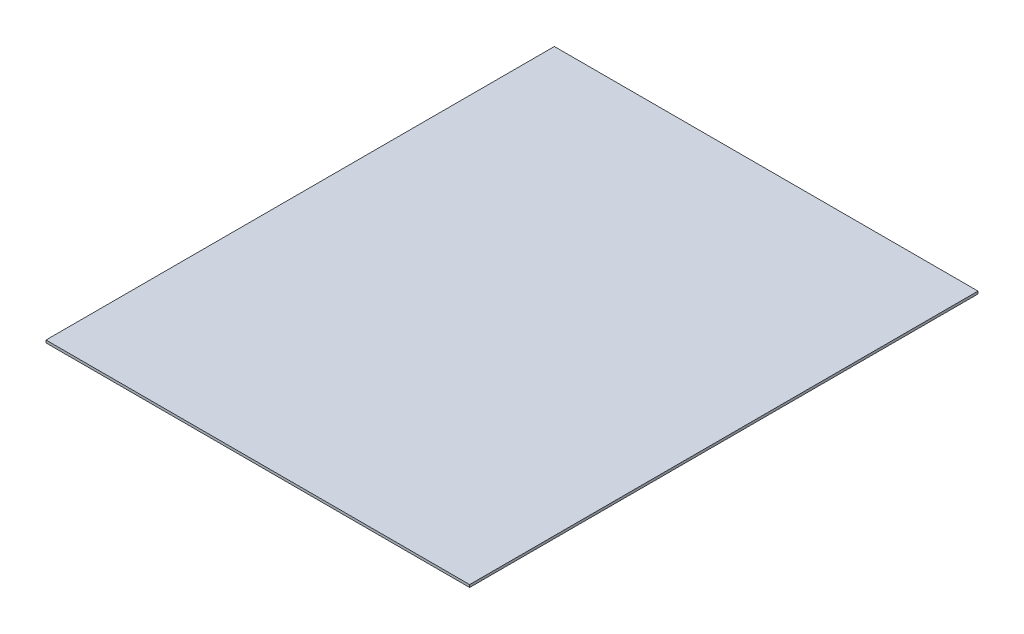
ISO-10303-21;
HEADER;
FILE_DESCRIPTION(('STEP AP214'),'2;1');
FILE_NAME('part.step','',(''),(''),'','','');
FILE_SCHEMA(('AUTOMOTIVE_DESIGN { 1 0 10303 214 1 1 1 1 }'));
ENDSEC;
DATA;
#1=APPLICATION_CONTEXT('core data for automotive mechanical design processes');
#2=APPLICATION_PROTOCOL_DEFINITION('international standard','automotive_design',2000,#1);
#3=PRODUCT_CONTEXT('',#1,'mechanical');
#4=PRODUCT('Part','Part','',(#3));
#5=PRODUCT_RELATED_PRODUCT_CATEGORY('part','',(#4));
#6=PRODUCT_DEFINITION_FORMATION('','',#4);
#7=PRODUCT_DEFINITION_CONTEXT('part definition',#1,'design');
#8=PRODUCT_DEFINITION('design','',#6,#7);
#9=PRODUCT_DEFINITION_SHAPE('','',#8);
#10=(LENGTH_UNIT() NAMED_UNIT(*) SI_UNIT(.MILLI.,.METRE.));
#11=(NAMED_UNIT(*) PLANE_ANGLE_UNIT() SI_UNIT($,.RADIAN.));
#12=(NAMED_UNIT(*) SI_UNIT($,.STERADIAN.) SOLID_ANGLE_UNIT());
#13=UNCERTAINTY_MEASURE_WITH_UNIT(LENGTH_MEASURE(1.E-05),#10,'distance_accuracy_value','');
#14=(GEOMETRIC_REPRESENTATION_CONTEXT(3) GLOBAL_UNCERTAINTY_ASSIGNED_CONTEXT((#13)) GLOBAL_UNIT_ASSIGNED_CONTEXT((#10,
#11,#12)) REPRESENTATION_CONTEXT('',''));
#15=CARTESIAN_POINT('',(0.,0.,0.));
#16=DIRECTION('',(0.,0.,1.));
#17=DIRECTION('',(1.,0.,0.));
#18=AXIS2_PLACEMENT_3D('',#15,#16,#17);
#19=CARTESIAN_POINT('',(-20.3333333333333,3.,-15.5833333333333));
#20=DIRECTION('',(1.,0.,0.));
#21=DIRECTION('',(0.,0.,-1.));
#22=AXIS2_PLACEMENT_3D('',#19,#20,#21);
#23=PLANE('',#22);
#24=DIRECTION('',(0.,0.,1.));
#25=VECTOR('',#24,1.);
#26=CARTESIAN_POINT('',(-20.3333333333333,0.,-15.5833333333333));
#27=LINE('',#26,#25);
#28=CARTESIAN_POINT('',(-20.3333333333333,0.,-15.5833333333333));
#29=VERTEX_POINT('',#28);
#30=CARTESIAN_POINT('',(-20.3333333333333,0.,584.416666666667));
#31=VERTEX_POINT('',#30);
#32=EDGE_CURVE('E96',#29,#31,#27,.T.);
#33=ORIENTED_EDGE('',*,*,#32,.T.);
#34=DIRECTION('',(0.,-1.,0.));
#35=VECTOR('',#34,1.);
#36=CARTESIAN_POINT('',(-20.3333333333333,3.,584.416666666667));
#37=LINE('',#36,#35);
#38=CARTESIAN_POINT('',(-20.3333333333333,3.,584.416666666667));
#39=VERTEX_POINT('',#38);
#40=EDGE_CURVE('E11',#39,#31,#37,.T.);
#41=ORIENTED_EDGE('',*,*,#40,.F.);
#42=DIRECTION('',(0.,0.,1.));
#43=VECTOR('',#42,1.);
#44=CARTESIAN_POINT('',(-20.3333333333333,3.,-15.5833333333333));
#45=LINE('',#44,#43);
#46=CARTESIAN_POINT('',(-20.3333333333333,3.,-15.5833333333333));
#47=VERTEX_POINT('',#46);
#48=EDGE_CURVE('E84',#47,#39,#45,.T.);
#49=ORIENTED_EDGE('',*,*,#48,.F.);
#50=DIRECTION('',(0.,-1.,0.));
#51=VECTOR('',#50,1.);
#52=CARTESIAN_POINT('',(-20.3333333333333,3.,-15.5833333333333));
#53=LINE('',#52,#51);
#54=EDGE_CURVE('E92',#47,#29,#53,.T.);
#55=ORIENTED_EDGE('',*,*,#54,.T.);
#56=EDGE_LOOP('',(#33,#41,#49,#55));
#57=FACE_BOUND('',#56,.T.);
#58=ADVANCED_FACE('F33',(#57),#23,.F.);
#59=CARTESIAN_POINT('',(-20.3333333333333,3.,584.416666666667));
#60=DIRECTION('',(0.,0.,-1.));
#61=DIRECTION('',(-1.,0.,0.));
#62=AXIS2_PLACEMENT_3D('',#59,#60,#61);
#63=PLANE('',#62);
#64=DIRECTION('',(1.,0.,0.));
#65=VECTOR('',#64,1.);
#66=CARTESIAN_POINT('',(-20.3333333333333,0.,584.416666666667));
#67=LINE('',#66,#65);
#68=CARTESIAN_POINT('',(479.666666666667,0.,584.416666666667));
#69=VERTEX_POINT('',#68);
#70=EDGE_CURVE('E88',#31,#69,#67,.T.);
#71=ORIENTED_EDGE('',*,*,#70,.T.);
#72=DIRECTION('',(0.,-1.,0.));
#73=VECTOR('',#72,1.);
#74=CARTESIAN_POINT('',(479.666666666667,3.,584.416666666667));
#75=LINE('',#74,#73);
#76=CARTESIAN_POINT('',(479.666666666667,3.,584.416666666667));
#77=VERTEX_POINT('',#76);
#78=EDGE_CURVE('E41',#77,#69,#75,.T.);
#79=ORIENTED_EDGE('',*,*,#78,.F.);
#80=DIRECTION('',(1.,0.,0.));
#81=VECTOR('',#80,1.);
#82=CARTESIAN_POINT('',(-20.3333333333333,3.,584.416666666667));
#83=LINE('',#82,#81);
#84=EDGE_CURVE('E79',#39,#77,#83,.T.);
#85=ORIENTED_EDGE('',*,*,#84,.F.);
#86=ORIENTED_EDGE('',*,*,#40,.T.);
#87=EDGE_LOOP('',(#71,#79,#85,#86));
#88=FACE_BOUND('',#87,.T.);
#89=ADVANCED_FACE('F87',(#88),#63,.F.);
#90=CARTESIAN_POINT('',(479.666666666667,3.,-15.5833333333333));
#91=DIRECTION('',(-1.,0.,0.));
#92=DIRECTION('',(0.,0.,1.));
#93=AXIS2_PLACEMENT_3D('',#90,#91,#92);
#94=PLANE('',#93);
#95=DIRECTION('',(0.,0.,-1.));
#96=VECTOR('',#95,1.);
#97=CARTESIAN_POINT('',(479.666666666667,0.,-15.5833333333333));
#98=LINE('',#97,#96);
#99=CARTESIAN_POINT('',(479.666666666667,0.,-15.5833333333333));
#100=VERTEX_POINT('',#99);
#101=EDGE_CURVE('E66',#69,#100,#98,.T.);
#102=ORIENTED_EDGE('',*,*,#101,.T.);
#103=DIRECTION('',(0.,-1.,0.));
#104=VECTOR('',#103,1.);
#105=CARTESIAN_POINT('',(479.666666666667,3.,-15.5833333333333));
#106=LINE('',#105,#104);
#107=CARTESIAN_POINT('',(479.666666666667,3.,-15.5833333333333));
#108=VERTEX_POINT('',#107);
#109=EDGE_CURVE('E89',#108,#100,#106,.T.);
#110=ORIENTED_EDGE('',*,*,#109,.F.);
#111=DIRECTION('',(0.,0.,-1.));
#112=VECTOR('',#111,1.);
#113=CARTESIAN_POINT('',(479.666666666667,3.,-15.5833333333333));
#114=LINE('',#113,#112);
#115=EDGE_CURVE('E82',#77,#108,#114,.T.);
#116=ORIENTED_EDGE('',*,*,#115,.F.);
#117=ORIENTED_EDGE('',*,*,#78,.T.);
#118=EDGE_LOOP('',(#102,#110,#116,#117));
#119=FACE_BOUND('',#118,.T.);
#120=ADVANCED_FACE('F90',(#119),#94,.F.);
#121=CARTESIAN_POINT('',(-20.3333333333333,3.,-15.5833333333333));
#122=DIRECTION('',(0.,0.,1.));
#123=DIRECTION('',(1.,0.,0.));
#124=AXIS2_PLACEMENT_3D('',#121,#122,#123);
#125=PLANE('',#124);
#126=DIRECTION('',(-1.,0.,0.));
#127=VECTOR('',#126,1.);
#128=CARTESIAN_POINT('',(-20.3333333333333,0.,-15.5833333333333));
#129=LINE('',#128,#127);
#130=EDGE_CURVE('E72',#100,#29,#129,.T.);
#131=ORIENTED_EDGE('',*,*,#130,.T.);
#132=ORIENTED_EDGE('',*,*,#54,.F.);
#133=DIRECTION('',(-1.,0.,0.));
#134=VECTOR('',#133,1.);
#135=CARTESIAN_POINT('',(-20.3333333333333,3.,-15.5833333333333));
#136=LINE('',#135,#134);
#137=EDGE_CURVE('E49',#108,#47,#136,.T.);
#138=ORIENTED_EDGE('',*,*,#137,.F.);
#139=ORIENTED_EDGE('',*,*,#109,.T.);
#140=EDGE_LOOP('',(#131,#132,#138,#139));
#141=FACE_BOUND('',#140,.T.);
#142=ADVANCED_FACE('F103',(#141),#125,.F.);
#143=CARTESIAN_POINT('',(0.,3.,0.));
#144=DIRECTION('',(0.,1.,0.));
#145=DIRECTION('',(0.,0.,1.));
#146=AXIS2_PLACEMENT_3D('',#143,#144,#145);
#147=PLANE('',#146);
#148=ORIENTED_EDGE('',*,*,#48,.T.);
#149=ORIENTED_EDGE('',*,*,#84,.T.);
#150=ORIENTED_EDGE('',*,*,#115,.T.);
#151=ORIENTED_EDGE('',*,*,#137,.T.);
#152=EDGE_LOOP('',(#148,#149,#150,#151));
#153=FACE_BOUND('',#152,.T.);
#154=ADVANCED_FACE('F80',(#153),#147,.T.);
#155=CARTESIAN_POINT('',(0.,0.,0.));
#156=DIRECTION('',(0.,1.,0.));
#157=DIRECTION('',(0.,0.,1.));
#158=AXIS2_PLACEMENT_3D('',#155,#156,#157);
#159=PLANE('',#158);
#160=ORIENTED_EDGE('',*,*,#32,.F.);
#161=ORIENTED_EDGE('',*,*,#130,.F.);
#162=ORIENTED_EDGE('',*,*,#101,.F.);
#163=ORIENTED_EDGE('',*,*,#70,.F.);
#164=EDGE_LOOP('',(#160,#161,#162,#163));
#165=FACE_BOUND('',#164,.T.);
#166=ADVANCED_FACE('F106',(#165),#159,.F.);
#167=CLOSED_SHELL('',(#58,#89,#120,#142,#154,#166));
#168=MANIFOLD_SOLID_BREP('B2',#167);
#169=ADVANCED_BREP_SHAPE_REPRESENTATION('',(#18,#168),#14);
#170=SHAPE_DEFINITION_REPRESENTATION(#9,#169);
ENDSEC;
END-ISO-10303-21;
